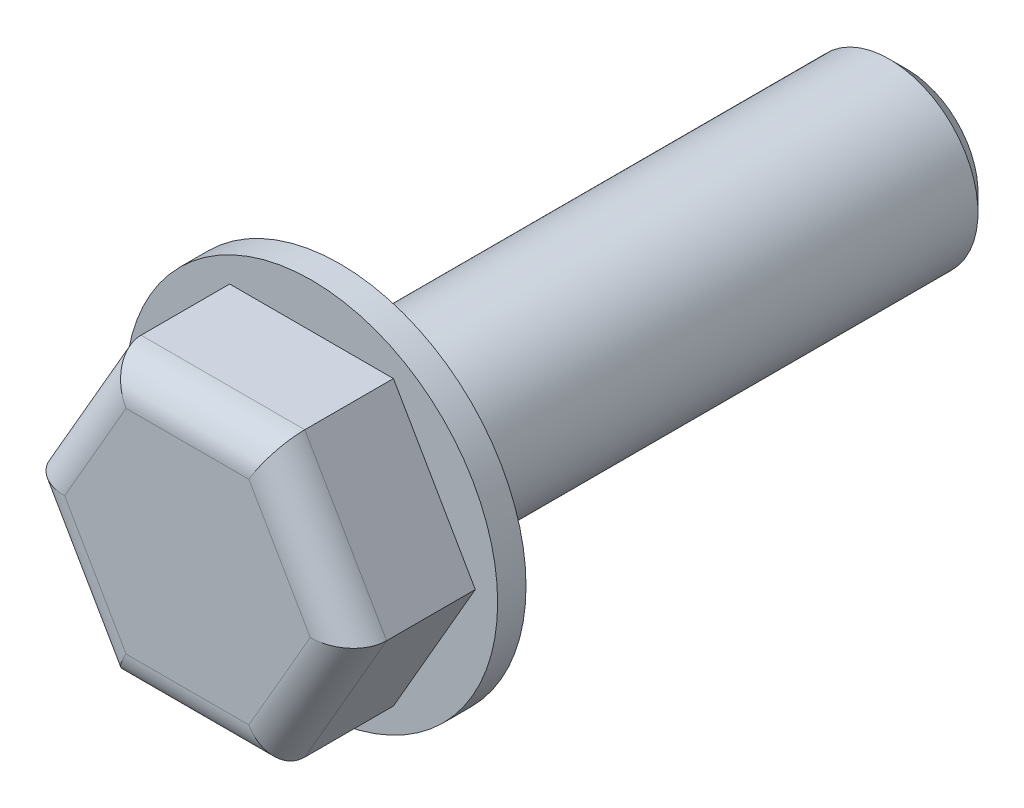
ISO-10303-21;
HEADER;
FILE_DESCRIPTION(('STEP AP214'),'2;1');
FILE_NAME('part.step','',(''),(''),'','','');
FILE_SCHEMA(('AUTOMOTIVE_DESIGN { 1 0 10303 214 1 1 1 1 }'));
ENDSEC;
DATA;
#1=APPLICATION_CONTEXT('core data for automotive mechanical design processes');
#2=APPLICATION_PROTOCOL_DEFINITION('international standard','automotive_design',2000,#1);
#3=PRODUCT_CONTEXT('',#1,'mechanical');
#4=PRODUCT('Part','Part','',(#3));
#5=PRODUCT_RELATED_PRODUCT_CATEGORY('part','',(#4));
#6=PRODUCT_DEFINITION_FORMATION('','',#4);
#7=PRODUCT_DEFINITION_CONTEXT('part definition',#1,'design');
#8=PRODUCT_DEFINITION('design','',#6,#7);
#9=PRODUCT_DEFINITION_SHAPE('','',#8);
#10=(LENGTH_UNIT() NAMED_UNIT(*) SI_UNIT(.MILLI.,.METRE.));
#11=(NAMED_UNIT(*) PLANE_ANGLE_UNIT() SI_UNIT($,.RADIAN.));
#12=(NAMED_UNIT(*) SI_UNIT($,.STERADIAN.) SOLID_ANGLE_UNIT());
#13=UNCERTAINTY_MEASURE_WITH_UNIT(LENGTH_MEASURE(1.E-05),#10,'distance_accuracy_value','');
#14=(GEOMETRIC_REPRESENTATION_CONTEXT(3) GLOBAL_UNCERTAINTY_ASSIGNED_CONTEXT((#13)) GLOBAL_UNIT_ASSIGNED_CONTEXT((#10,
#11,#12)) REPRESENTATION_CONTEXT('',''));
#15=CARTESIAN_POINT('',(0.,0.,0.));
#16=DIRECTION('',(0.,0.,1.));
#17=DIRECTION('',(1.,0.,0.));
#18=AXIS2_PLACEMENT_3D('',#15,#16,#17);
#19=CARTESIAN_POINT('',(0.,0.,0.8));
#20=DIRECTION('',(0.,0.,-1.));
#21=DIRECTION('',(-1.,0.,0.));
#22=AXIS2_PLACEMENT_3D('',#19,#20,#21);
#23=CYLINDRICAL_SURFACE('',#22,5.25);
#24=CARTESIAN_POINT('',(0.,0.,0.8));
#25=DIRECTION('',(0.,0.,1.));
#26=DIRECTION('',(1.,0.,0.));
#27=AXIS2_PLACEMENT_3D('',#24,#25,#26);
#28=CIRCLE('',#27,5.25);
#29=CARTESIAN_POINT('',(5.25,0.,0.8));
#30=VERTEX_POINT('',#29);
#31=EDGE_CURVE('E167',#30,#30,#28,.T.);
#32=ORIENTED_EDGE('',*,*,#31,.F.);
#33=EDGE_LOOP('',(#32));
#34=FACE_BOUND('',#33,.T.);
#35=CARTESIAN_POINT('',(0.,0.,0.));
#36=DIRECTION('',(0.,0.,1.));
#37=DIRECTION('',(1.,0.,0.));
#38=AXIS2_PLACEMENT_3D('',#35,#36,#37);
#39=CIRCLE('',#38,5.25);
#40=CARTESIAN_POINT('',(5.25,0.,0.));
#41=VERTEX_POINT('',#40);
#42=EDGE_CURVE('E166',#41,#41,#39,.T.);
#43=ORIENTED_EDGE('',*,*,#42,.T.);
#44=EDGE_LOOP('',(#43));
#45=FACE_BOUND('',#44,.T.);
#46=ADVANCED_FACE('F52',(#34,#45),#23,.T.);
#47=CARTESIAN_POINT('',(0.,0.,0.8));
#48=DIRECTION('',(0.,0.,1.));
#49=DIRECTION('',(1.,0.,0.));
#50=AXIS2_PLACEMENT_3D('',#47,#48,#49);
#51=PLANE('',#50);
#52=DIRECTION('',(-1.,0.,0.));
#53=VECTOR('',#52,1.);
#54=CARTESIAN_POINT('',(2.3094010767585,4.,0.8));
#55=LINE('',#54,#53);
#56=CARTESIAN_POINT('',(2.3094010767585,4.,0.8));
#57=VERTEX_POINT('',#56);
#58=CARTESIAN_POINT('',(-2.3094010767585,4.,0.8));
#59=VERTEX_POINT('',#58);
#60=EDGE_CURVE('E145',#57,#59,#55,.T.);
#61=ORIENTED_EDGE('',*,*,#60,.F.);
#62=DIRECTION('',(-0.5,0.866025403784439,0.));
#63=VECTOR('',#62,1.);
#64=CARTESIAN_POINT('',(4.61880215351701,0.,0.8));
#65=LINE('',#64,#63);
#66=CARTESIAN_POINT('',(4.61880215351701,0.,0.8));
#67=VERTEX_POINT('',#66);
#68=EDGE_CURVE('E155',#67,#57,#65,.T.);
#69=ORIENTED_EDGE('',*,*,#68,.F.);
#70=DIRECTION('',(0.5,0.866025403784439,0.));
#71=VECTOR('',#70,1.);
#72=CARTESIAN_POINT('',(2.3094010767585,-4.,0.8));
#73=LINE('',#72,#71);
#74=CARTESIAN_POINT('',(2.3094010767585,-4.,0.8));
#75=VERTEX_POINT('',#74);
#76=EDGE_CURVE('E152',#75,#67,#73,.T.);
#77=ORIENTED_EDGE('',*,*,#76,.F.);
#78=DIRECTION('',(1.,0.,0.));
#79=VECTOR('',#78,1.);
#80=CARTESIAN_POINT('',(-2.3094010767585,-4.,0.8));
#81=LINE('',#80,#79);
#82=CARTESIAN_POINT('',(-2.3094010767585,-4.,0.8));
#83=VERTEX_POINT('',#82);
#84=EDGE_CURVE('E142',#83,#75,#81,.T.);
#85=ORIENTED_EDGE('',*,*,#84,.F.);
#86=DIRECTION('',(0.5,-0.866025403784439,0.));
#87=VECTOR('',#86,1.);
#88=CARTESIAN_POINT('',(-4.618802153517,0.,0.8));
#89=LINE('',#88,#87);
#90=CARTESIAN_POINT('',(-4.618802153517,0.,0.8));
#91=VERTEX_POINT('',#90);
#92=EDGE_CURVE('E126',#91,#83,#89,.T.);
#93=ORIENTED_EDGE('',*,*,#92,.F.);
#94=DIRECTION('',(-0.5,-0.866025403784439,0.));
#95=VECTOR('',#94,1.);
#96=CARTESIAN_POINT('',(-2.3094010767585,4.,0.8));
#97=LINE('',#96,#95);
#98=EDGE_CURVE('E138',#59,#91,#97,.T.);
#99=ORIENTED_EDGE('',*,*,#98,.F.);
#100=EDGE_LOOP('',(#61,#69,#77,#85,#93,#99));
#101=FACE_BOUND('',#100,.T.);
#102=ORIENTED_EDGE('',*,*,#31,.T.);
#103=EDGE_LOOP('',(#102));
#104=FACE_BOUND('',#103,.T.);
#105=ADVANCED_FACE('F136',(#101,#104),#51,.T.);
#106=CARTESIAN_POINT('',(0.,0.,0.));
#107=DIRECTION('',(0.,0.,1.));
#108=DIRECTION('',(1.,0.,0.));
#109=AXIS2_PLACEMENT_3D('',#106,#107,#108);
#110=PLANE('',#109);
#111=CARTESIAN_POINT('',(0.,0.,0.));
#112=DIRECTION('',(0.,0.,-1.));
#113=DIRECTION('',(-1.,0.,0.));
#114=AXIS2_PLACEMENT_3D('',#111,#112,#113);
#115=CIRCLE('',#114,2.5);
#116=CARTESIAN_POINT('',(-2.5,0.,0.));
#117=VERTEX_POINT('',#116);
#118=EDGE_CURVE('E170',#117,#117,#115,.T.);
#119=ORIENTED_EDGE('',*,*,#118,.F.);
#120=EDGE_LOOP('',(#119));
#121=FACE_BOUND('',#120,.T.);
#122=ORIENTED_EDGE('',*,*,#42,.F.);
#123=EDGE_LOOP('',(#122));
#124=FACE_BOUND('',#123,.T.);
#125=ADVANCED_FACE('F232',(#121,#124),#110,.F.);
#126=CARTESIAN_POINT('',(2.3094010767585,4.,4.3));
#127=DIRECTION('',(0.,-1.,0.));
#128=DIRECTION('',(1.,0.,0.));
#129=AXIS2_PLACEMENT_3D('',#126,#127,#128);
#130=PLANE('',#129);
#131=DIRECTION('',(0.,0.,-1.));
#132=VECTOR('',#131,1.);
#133=CARTESIAN_POINT('',(-2.3094010767585,4.,4.3));
#134=LINE('',#133,#132);
#135=CARTESIAN_POINT('',(-2.3094010767585,4.,3.3));
#136=VERTEX_POINT('',#135);
#137=EDGE_CURVE('E129',#136,#59,#134,.T.);
#138=ORIENTED_EDGE('',*,*,#137,.F.);
#139=DIRECTION('',(-1.,0.,0.));
#140=VECTOR('',#139,1.);
#141=CARTESIAN_POINT('',(2.3094010767585,4.,3.3));
#142=LINE('',#141,#140);
#143=CARTESIAN_POINT('',(2.3094010767585,4.,3.3));
#144=VERTEX_POINT('',#143);
#145=EDGE_CURVE('E195',#136,#144,#142,.F.);
#146=ORIENTED_EDGE('',*,*,#145,.T.);
#147=DIRECTION('',(0.,0.,-1.));
#148=VECTOR('',#147,1.);
#149=CARTESIAN_POINT('',(2.3094010767585,4.,4.3));
#150=LINE('',#149,#148);
#151=EDGE_CURVE('E158',#144,#57,#150,.T.);
#152=ORIENTED_EDGE('',*,*,#151,.T.);
#153=ORIENTED_EDGE('',*,*,#60,.T.);
#154=EDGE_LOOP('',(#138,#146,#152,#153));
#155=FACE_BOUND('',#154,.T.);
#156=ADVANCED_FACE('F269',(#155),#130,.F.);
#157=CARTESIAN_POINT('',(-2.3094010767585,4.,4.3));
#158=DIRECTION('',(0.866025403784439,-0.5,0.));
#159=DIRECTION('',(0.5,0.866025403784439,0.));
#160=AXIS2_PLACEMENT_3D('',#157,#158,#159);
#161=PLANE('',#160);
#162=DIRECTION('',(0.,0.,-1.));
#163=VECTOR('',#162,1.);
#164=CARTESIAN_POINT('',(-4.618802153517,0.,4.3));
#165=LINE('',#164,#163);
#166=CARTESIAN_POINT('',(-4.618802153517,0.,3.3));
#167=VERTEX_POINT('',#166);
#168=EDGE_CURVE('E123',#167,#91,#165,.T.);
#169=ORIENTED_EDGE('',*,*,#168,.F.);
#170=DIRECTION('',(-0.5,-0.866025403784439,0.));
#171=VECTOR('',#170,1.);
#172=CARTESIAN_POINT('',(-2.3094010767585,4.,3.3));
#173=LINE('',#172,#171);
#174=EDGE_CURVE('E68',#167,#136,#173,.F.);
#175=ORIENTED_EDGE('',*,*,#174,.T.);
#176=ORIENTED_EDGE('',*,*,#137,.T.);
#177=ORIENTED_EDGE('',*,*,#98,.T.);
#178=EDGE_LOOP('',(#169,#175,#176,#177));
#179=FACE_BOUND('',#178,.T.);
#180=ADVANCED_FACE('F144',(#179),#161,.F.);
#181=CARTESIAN_POINT('',(-4.618802153517,0.,4.3));
#182=DIRECTION('',(0.866025403784439,0.5,0.));
#183=DIRECTION('',(-0.5,0.866025403784439,0.));
#184=AXIS2_PLACEMENT_3D('',#181,#182,#183);
#185=PLANE('',#184);
#186=DIRECTION('',(0.,0.,-1.));
#187=VECTOR('',#186,1.);
#188=CARTESIAN_POINT('',(-2.3094010767585,-4.,4.3));
#189=LINE('',#188,#187);
#190=CARTESIAN_POINT('',(-2.3094010767585,-4.,3.3));
#191=VERTEX_POINT('',#190);
#192=EDGE_CURVE('E130',#191,#83,#189,.T.);
#193=ORIENTED_EDGE('',*,*,#192,.F.);
#194=DIRECTION('',(0.5,-0.866025403784439,0.));
#195=VECTOR('',#194,1.);
#196=CARTESIAN_POINT('',(-4.618802153517,0.,3.3));
#197=LINE('',#196,#195);
#198=EDGE_CURVE('E76',#191,#167,#197,.F.);
#199=ORIENTED_EDGE('',*,*,#198,.T.);
#200=ORIENTED_EDGE('',*,*,#168,.T.);
#201=ORIENTED_EDGE('',*,*,#92,.T.);
#202=EDGE_LOOP('',(#193,#199,#200,#201));
#203=FACE_BOUND('',#202,.T.);
#204=ADVANCED_FACE('F125',(#203),#185,.F.);
#205=CARTESIAN_POINT('',(-2.3094010767585,-4.,4.3));
#206=DIRECTION('',(0.,1.,0.));
#207=DIRECTION('',(0.,0.,1.));
#208=AXIS2_PLACEMENT_3D('',#205,#206,#207);
#209=PLANE('',#208);
#210=DIRECTION('',(0.,0.,-1.));
#211=VECTOR('',#210,1.);
#212=CARTESIAN_POINT('',(2.3094010767585,-4.,4.3));
#213=LINE('',#212,#211);
#214=CARTESIAN_POINT('',(2.3094010767585,-4.,3.3));
#215=VERTEX_POINT('',#214);
#216=EDGE_CURVE('E162',#215,#75,#213,.T.);
#217=ORIENTED_EDGE('',*,*,#216,.F.);
#218=DIRECTION('',(1.,0.,0.));
#219=VECTOR('',#218,1.);
#220=CARTESIAN_POINT('',(-2.3094010767585,-4.,3.3));
#221=LINE('',#220,#219);
#222=EDGE_CURVE('E191',#215,#191,#221,.F.);
#223=ORIENTED_EDGE('',*,*,#222,.T.);
#224=ORIENTED_EDGE('',*,*,#192,.T.);
#225=ORIENTED_EDGE('',*,*,#84,.T.);
#226=EDGE_LOOP('',(#217,#223,#224,#225));
#227=FACE_BOUND('',#226,.T.);
#228=ADVANCED_FACE('F285',(#227),#209,.F.);
#229=CARTESIAN_POINT('',(2.3094010767585,-4.,4.3));
#230=DIRECTION('',(-0.866025403784439,0.5,0.));
#231=DIRECTION('',(-0.5,-0.866025403784439,0.));
#232=AXIS2_PLACEMENT_3D('',#229,#230,#231);
#233=PLANE('',#232);
#234=DIRECTION('',(0.,0.,-1.));
#235=VECTOR('',#234,1.);
#236=CARTESIAN_POINT('',(4.61880215351701,0.,4.3));
#237=LINE('',#236,#235);
#238=CARTESIAN_POINT('',(4.61880215351701,0.,3.3));
#239=VERTEX_POINT('',#238);
#240=EDGE_CURVE('E160',#239,#67,#237,.T.);
#241=ORIENTED_EDGE('',*,*,#240,.F.);
#242=DIRECTION('',(0.5,0.866025403784439,0.));
#243=VECTOR('',#242,1.);
#244=CARTESIAN_POINT('',(2.3094010767585,-4.,3.3));
#245=LINE('',#244,#243);
#246=EDGE_CURVE('E189',#239,#215,#245,.F.);
#247=ORIENTED_EDGE('',*,*,#246,.T.);
#248=ORIENTED_EDGE('',*,*,#216,.T.);
#249=ORIENTED_EDGE('',*,*,#76,.T.);
#250=EDGE_LOOP('',(#241,#247,#248,#249));
#251=FACE_BOUND('',#250,.T.);
#252=ADVANCED_FACE('F282',(#251),#233,.F.);
#253=CARTESIAN_POINT('',(4.61880215351701,0.,4.3));
#254=DIRECTION('',(-0.866025403784439,-0.5,0.));
#255=DIRECTION('',(0.5,-0.866025403784439,0.));
#256=AXIS2_PLACEMENT_3D('',#253,#254,#255);
#257=PLANE('',#256);
#258=ORIENTED_EDGE('',*,*,#151,.F.);
#259=DIRECTION('',(-0.5,0.866025403784439,0.));
#260=VECTOR('',#259,1.);
#261=CARTESIAN_POINT('',(4.61880215351701,0.,3.3));
#262=LINE('',#261,#260);
#263=EDGE_CURVE('E186',#144,#239,#262,.F.);
#264=ORIENTED_EDGE('',*,*,#263,.T.);
#265=ORIENTED_EDGE('',*,*,#240,.T.);
#266=ORIENTED_EDGE('',*,*,#68,.T.);
#267=EDGE_LOOP('',(#258,#264,#265,#266));
#268=FACE_BOUND('',#267,.T.);
#269=ADVANCED_FACE('F272',(#268),#257,.F.);
#270=CARTESIAN_POINT('',(0.,0.,4.3));
#271=DIRECTION('',(0.,0.,1.));
#272=DIRECTION('',(1.,0.,0.));
#273=AXIS2_PLACEMENT_3D('',#270,#271,#272);
#274=PLANE('',#273);
#275=DIRECTION('',(0.5,0.866025403784439,0.));
#276=VECTOR('',#275,1.);
#277=CARTESIAN_POINT('',(3.75277674973257,0.500000000000002,4.3));
#278=LINE('',#277,#276);
#279=CARTESIAN_POINT('',(1.73205080756888,-3.,4.3));
#280=VERTEX_POINT('',#279);
#281=CARTESIAN_POINT('',(3.46410161513775,0.,4.3));
#282=VERTEX_POINT('',#281);
#283=EDGE_CURVE('E181',#280,#282,#278,.T.);
#284=ORIENTED_EDGE('',*,*,#283,.T.);
#285=DIRECTION('',(-0.5,0.866025403784439,0.));
#286=VECTOR('',#285,1.);
#287=CARTESIAN_POINT('',(1.44337567297407,3.5,4.3));
#288=LINE('',#287,#286);
#289=CARTESIAN_POINT('',(1.73205080756888,3.,4.3));
#290=VERTEX_POINT('',#289);
#291=EDGE_CURVE('E183',#282,#290,#288,.T.);
#292=ORIENTED_EDGE('',*,*,#291,.T.);
#293=DIRECTION('',(-1.,0.,0.));
#294=VECTOR('',#293,1.);
#295=CARTESIAN_POINT('',(-2.3094010767585,3.,4.3));
#296=LINE('',#295,#294);
#297=CARTESIAN_POINT('',(-1.73205080756888,3.,4.3));
#298=VERTEX_POINT('',#297);
#299=EDGE_CURVE('E173',#290,#298,#296,.T.);
#300=ORIENTED_EDGE('',*,*,#299,.T.);
#301=DIRECTION('',(-0.5,-0.866025403784439,0.));
#302=VECTOR('',#301,1.);
#303=CARTESIAN_POINT('',(-3.75277674973257,-0.5,4.3));
#304=LINE('',#303,#302);
#305=CARTESIAN_POINT('',(-3.46410161513775,0.,4.3));
#306=VERTEX_POINT('',#305);
#307=EDGE_CURVE('E175',#298,#306,#304,.T.);
#308=ORIENTED_EDGE('',*,*,#307,.T.);
#309=DIRECTION('',(0.5,-0.866025403784439,0.));
#310=VECTOR('',#309,1.);
#311=CARTESIAN_POINT('',(-1.44337567297406,-3.5,4.3));
#312=LINE('',#311,#310);
#313=CARTESIAN_POINT('',(-1.73205080756887,-3.,4.3));
#314=VERTEX_POINT('',#313);
#315=EDGE_CURVE('E177',#306,#314,#312,.T.);
#316=ORIENTED_EDGE('',*,*,#315,.T.);
#317=DIRECTION('',(1.,0.,0.));
#318=VECTOR('',#317,1.);
#319=CARTESIAN_POINT('',(2.3094010767585,-3.,4.3));
#320=LINE('',#319,#318);
#321=EDGE_CURVE('E179',#314,#280,#320,.T.);
#322=ORIENTED_EDGE('',*,*,#321,.T.);
#323=EDGE_LOOP('',(#284,#292,#300,#308,#316,#322));
#324=FACE_BOUND('',#323,.T.);
#325=ADVANCED_FACE('F288',(#324),#274,.T.);
#326=CARTESIAN_POINT('',(0.,0.,-16.));
#327=DIRECTION('',(0.,0.,1.));
#328=DIRECTION('',(1.,0.,0.));
#329=AXIS2_PLACEMENT_3D('',#326,#327,#328);
#330=CYLINDRICAL_SURFACE('',#329,2.5);
#331=CARTESIAN_POINT('',(0.,0.,-15.5));
#332=DIRECTION('',(0.,0.,-1.));
#333=DIRECTION('',(-1.,0.,0.));
#334=AXIS2_PLACEMENT_3D('',#331,#332,#333);
#335=CIRCLE('',#334,2.5);
#336=CARTESIAN_POINT('',(-2.5,0.,-15.5));
#337=VERTEX_POINT('',#336);
#338=EDGE_CURVE('E13',#337,#337,#335,.F.);
#339=ORIENTED_EDGE('',*,*,#338,.T.);
#340=EDGE_LOOP('',(#339));
#341=FACE_BOUND('',#340,.T.);
#342=ORIENTED_EDGE('',*,*,#118,.T.);
#343=EDGE_LOOP('',(#342));
#344=FACE_BOUND('',#343,.T.);
#345=ADVANCED_FACE('F258',(#341,#344),#330,.T.);
#346=CARTESIAN_POINT('',(0.,0.,-16.));
#347=DIRECTION('',(0.,0.,-1.));
#348=DIRECTION('',(-1.,0.,0.));
#349=AXIS2_PLACEMENT_3D('',#346,#347,#348);
#350=PLANE('',#349);
#351=CARTESIAN_POINT('',(0.,0.,-16.));
#352=DIRECTION('',(0.,0.,-1.));
#353=DIRECTION('',(-1.,0.,0.));
#354=AXIS2_PLACEMENT_3D('',#351,#352,#353);
#355=CIRCLE('',#354,2.);
#356=CARTESIAN_POINT('',(-2.,0.,-16.));
#357=VERTEX_POINT('',#356);
#358=EDGE_CURVE('E61',#357,#357,#355,.T.);
#359=ORIENTED_EDGE('',*,*,#358,.T.);
#360=EDGE_LOOP('',(#359));
#361=FACE_BOUND('',#360,.T.);
#362=ADVANCED_FACE('F214',(#361),#350,.T.);
#363=CARTESIAN_POINT('',(-2.59807621135331,-1.5,3.3));
#364=DIRECTION('',(-0.5,0.866025403784439,0.));
#365=DIRECTION('',(-0.866025403784439,-0.5,0.));
#366=AXIS2_PLACEMENT_3D('',#363,#364,#365);
#367=CYLINDRICAL_SURFACE('',#366,1.);
#368=CARTESIAN_POINT('',(-3.46410161513775,0.,3.3));
#369=DIRECTION('',(0.,1.,0.));
#370=DIRECTION('',(1.,0.,0.));
#371=AXIS2_PLACEMENT_3D('',#368,#369,#370);
#372=ELLIPSE('',#371,1.15470053837925,1.);
#373=EDGE_CURVE('E207',#167,#306,#372,.T.);
#374=ORIENTED_EDGE('',*,*,#373,.F.);
#375=ORIENTED_EDGE('',*,*,#198,.F.);
#376=CARTESIAN_POINT('',(-1.73205080756887,-3.,3.3));
#377=DIRECTION('',(-0.866025403784439,0.5,0.));
#378=DIRECTION('',(0.5,0.866025403784439,0.));
#379=AXIS2_PLACEMENT_3D('',#376,#377,#378);
#380=ELLIPSE('',#379,1.15470053837925,1.);
#381=EDGE_CURVE('E147',#314,#191,#380,.F.);
#382=ORIENTED_EDGE('',*,*,#381,.F.);
#383=ORIENTED_EDGE('',*,*,#315,.F.);
#384=EDGE_LOOP('',(#374,#375,#382,#383));
#385=FACE_BOUND('',#384,.T.);
#386=ADVANCED_FACE('F251',(#385),#367,.T.);
#387=CARTESIAN_POINT('',(0.,-3.,3.3));
#388=DIRECTION('',(-1.,0.,0.));
#389=DIRECTION('',(0.,0.,1.));
#390=AXIS2_PLACEMENT_3D('',#387,#388,#389);
#391=CYLINDRICAL_SURFACE('',#390,1.);
#392=ORIENTED_EDGE('',*,*,#381,.T.);
#393=ORIENTED_EDGE('',*,*,#222,.F.);
#394=CARTESIAN_POINT('',(1.73205080756888,-3.,3.3));
#395=DIRECTION('',(-0.866025403784439,-0.5,0.));
#396=DIRECTION('',(-0.5,0.866025403784439,0.));
#397=AXIS2_PLACEMENT_3D('',#394,#395,#396);
#398=ELLIPSE('',#397,1.15470053837925,1.);
#399=EDGE_CURVE('E204',#280,#215,#398,.F.);
#400=ORIENTED_EDGE('',*,*,#399,.F.);
#401=ORIENTED_EDGE('',*,*,#321,.F.);
#402=EDGE_LOOP('',(#392,#393,#400,#401));
#403=FACE_BOUND('',#402,.T.);
#404=ADVANCED_FACE('F248',(#403),#391,.T.);
#405=CARTESIAN_POINT('',(-2.59807621135332,1.5,3.3));
#406=DIRECTION('',(0.5,0.866025403784439,0.));
#407=DIRECTION('',(-0.866025403784439,0.5,0.));
#408=AXIS2_PLACEMENT_3D('',#405,#406,#407);
#409=CYLINDRICAL_SURFACE('',#408,1.);
#410=ORIENTED_EDGE('',*,*,#373,.T.);
#411=ORIENTED_EDGE('',*,*,#307,.F.);
#412=CARTESIAN_POINT('',(-1.73205080756888,3.,3.3));
#413=DIRECTION('',(0.866025403784439,0.5,0.));
#414=DIRECTION('',(0.5,-0.866025403784439,0.));
#415=AXIS2_PLACEMENT_3D('',#412,#413,#414);
#416=ELLIPSE('',#415,1.15470053837925,1.);
#417=EDGE_CURVE('E201',#136,#298,#416,.T.);
#418=ORIENTED_EDGE('',*,*,#417,.F.);
#419=ORIENTED_EDGE('',*,*,#174,.F.);
#420=EDGE_LOOP('',(#410,#411,#418,#419));
#421=FACE_BOUND('',#420,.T.);
#422=ADVANCED_FACE('F244',(#421),#409,.T.);
#423=CARTESIAN_POINT('',(2.59807621135332,-1.5,3.3));
#424=DIRECTION('',(-0.5,-0.866025403784439,0.));
#425=DIRECTION('',(0.866025403784439,-0.5,0.));
#426=AXIS2_PLACEMENT_3D('',#423,#424,#425);
#427=CYLINDRICAL_SURFACE('',#426,1.);
#428=ORIENTED_EDGE('',*,*,#399,.T.);
#429=ORIENTED_EDGE('',*,*,#246,.F.);
#430=CARTESIAN_POINT('',(3.46410161513775,0.,3.3));
#431=DIRECTION('',(0.,-1.,0.));
#432=DIRECTION('',(-1.,0.,0.));
#433=AXIS2_PLACEMENT_3D('',#430,#431,#432);
#434=ELLIPSE('',#433,1.15470053837925,1.);
#435=EDGE_CURVE('E199',#282,#239,#434,.F.);
#436=ORIENTED_EDGE('',*,*,#435,.F.);
#437=ORIENTED_EDGE('',*,*,#283,.F.);
#438=EDGE_LOOP('',(#428,#429,#436,#437));
#439=FACE_BOUND('',#438,.T.);
#440=ADVANCED_FACE('F240',(#439),#427,.T.);
#441=CARTESIAN_POINT('',(0.,3.,3.3));
#442=DIRECTION('',(1.,0.,0.));
#443=DIRECTION('',(0.,1.,0.));
#444=AXIS2_PLACEMENT_3D('',#441,#442,#443);
#445=CYLINDRICAL_SURFACE('',#444,1.);
#446=ORIENTED_EDGE('',*,*,#417,.T.);
#447=ORIENTED_EDGE('',*,*,#299,.F.);
#448=CARTESIAN_POINT('',(1.73205080756888,3.,3.3));
#449=DIRECTION('',(0.866025403784439,-0.5,0.));
#450=DIRECTION('',(0.5,0.866025403784439,0.));
#451=AXIS2_PLACEMENT_3D('',#448,#449,#450);
#452=ELLIPSE('',#451,1.15470053837925,1.);
#453=EDGE_CURVE('E197',#144,#290,#452,.T.);
#454=ORIENTED_EDGE('',*,*,#453,.F.);
#455=ORIENTED_EDGE('',*,*,#145,.F.);
#456=EDGE_LOOP('',(#446,#447,#454,#455));
#457=FACE_BOUND('',#456,.T.);
#458=ADVANCED_FACE('F222',(#457),#445,.T.);
#459=CARTESIAN_POINT('',(2.59807621135332,1.5,3.3));
#460=DIRECTION('',(0.5,-0.866025403784439,0.));
#461=DIRECTION('',(0.866025403784439,0.5,0.));
#462=AXIS2_PLACEMENT_3D('',#459,#460,#461);
#463=CYLINDRICAL_SURFACE('',#462,1.);
#464=ORIENTED_EDGE('',*,*,#435,.T.);
#465=ORIENTED_EDGE('',*,*,#263,.F.);
#466=ORIENTED_EDGE('',*,*,#453,.T.);
#467=ORIENTED_EDGE('',*,*,#291,.F.);
#468=EDGE_LOOP('',(#464,#465,#466,#467));
#469=FACE_BOUND('',#468,.T.);
#470=ADVANCED_FACE('F217',(#469),#463,.T.);
#471=CARTESIAN_POINT('',(0.,0.,-16.));
#472=DIRECTION('',(0.,0.,1.));
#473=DIRECTION('',(1.,0.,0.));
#474=AXIS2_PLACEMENT_3D('',#471,#472,#473);
#475=CONICAL_SURFACE('',#474,2.,0.78539816339745);
#476=ORIENTED_EDGE('',*,*,#338,.F.);
#477=EDGE_LOOP('',(#476));
#478=FACE_BOUND('',#477,.T.);
#479=ORIENTED_EDGE('',*,*,#358,.F.);
#480=EDGE_LOOP('',(#479));
#481=FACE_BOUND('',#480,.T.);
#482=ADVANCED_FACE('F55',(#478,#481),#475,.T.);
#483=CLOSED_SHELL('',(#46,#105,#125,#156,#180,#204,#228,#252,#269,#325,#345,#362,#386,#404,#422,
#440,#458,#470,#482));
#484=MANIFOLD_SOLID_BREP('B2',#483);
#485=ADVANCED_BREP_SHAPE_REPRESENTATION('',(#18,#484),#14);
#486=SHAPE_DEFINITION_REPRESENTATION(#9,#485);
ENDSEC;
END-ISO-10303-21;
